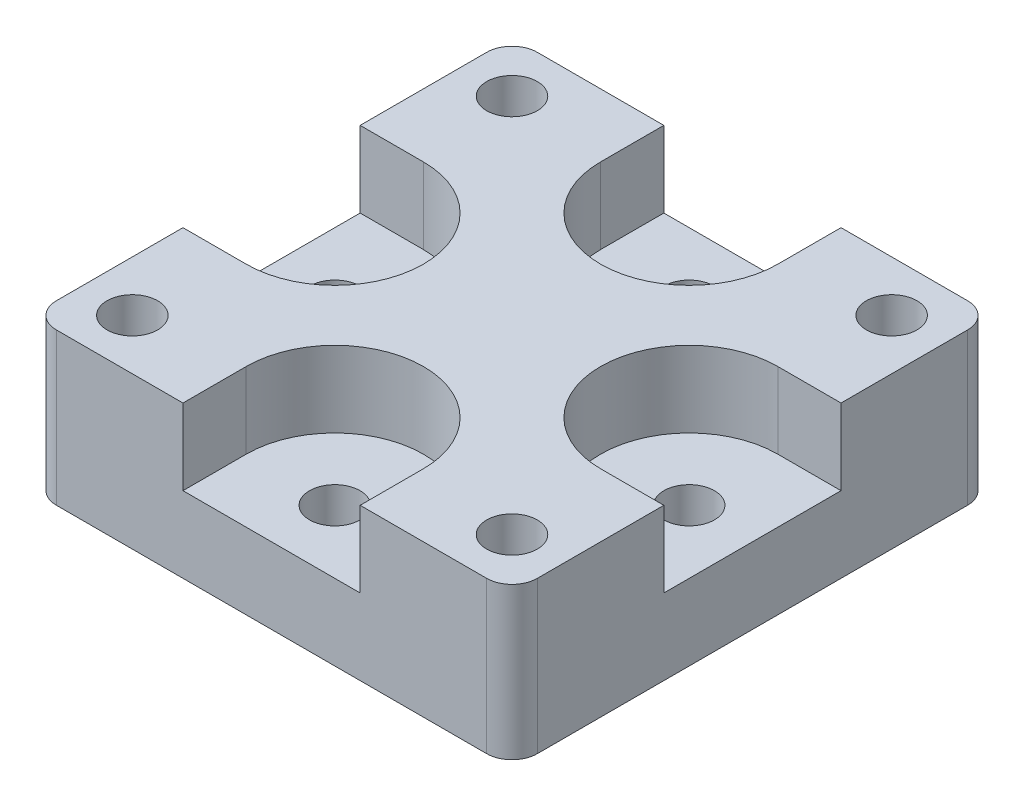
ISO-10303-21;
HEADER;
FILE_DESCRIPTION(('STEP AP214'),'2;1');
FILE_NAME('part.step','',(''),(''),'','','');
FILE_SCHEMA(('AUTOMOTIVE_DESIGN { 1 0 10303 214 1 1 1 1 }'));
ENDSEC;
DATA;
#1=APPLICATION_CONTEXT('core data for automotive mechanical design processes');
#2=APPLICATION_PROTOCOL_DEFINITION('international standard','automotive_design',2000,#1);
#3=PRODUCT_CONTEXT('',#1,'mechanical');
#4=PRODUCT('Part','Part','',(#3));
#5=PRODUCT_RELATED_PRODUCT_CATEGORY('part','',(#4));
#6=PRODUCT_DEFINITION_FORMATION('','',#4);
#7=PRODUCT_DEFINITION_CONTEXT('part definition',#1,'design');
#8=PRODUCT_DEFINITION('design','',#6,#7);
#9=PRODUCT_DEFINITION_SHAPE('','',#8);
#10=(LENGTH_UNIT() NAMED_UNIT(*) SI_UNIT(.MILLI.,.METRE.));
#11=(NAMED_UNIT(*) PLANE_ANGLE_UNIT() SI_UNIT($,.RADIAN.));
#12=(NAMED_UNIT(*) SI_UNIT($,.STERADIAN.) SOLID_ANGLE_UNIT());
#13=UNCERTAINTY_MEASURE_WITH_UNIT(LENGTH_MEASURE(1.E-05),#10,'distance_accuracy_value','');
#14=(GEOMETRIC_REPRESENTATION_CONTEXT(3) GLOBAL_UNCERTAINTY_ASSIGNED_CONTEXT((#13)) GLOBAL_UNIT_ASSIGNED_CONTEXT((#10,
#11,#12)) REPRESENTATION_CONTEXT('',''));
#15=CARTESIAN_POINT('',(0.,0.,0.));
#16=DIRECTION('',(0.,0.,1.));
#17=DIRECTION('',(1.,0.,0.));
#18=AXIS2_PLACEMENT_3D('',#15,#16,#17);
#19=CARTESIAN_POINT('',(2.5,0.,-9.5));
#20=DIRECTION('',(0.,1.,0.));
#21=DIRECTION('',(0.,0.,1.));
#22=AXIS2_PLACEMENT_3D('',#19,#20,#21);
#23=CYLINDRICAL_SURFACE('',#22,1.);
#24=CARTESIAN_POINT('',(2.5,0.,-9.5));
#25=DIRECTION('',(0.,1.,0.));
#26=DIRECTION('',(0.,0.,1.));
#27=AXIS2_PLACEMENT_3D('',#24,#25,#26);
#28=CIRCLE('',#27,1.);
#29=CARTESIAN_POINT('',(2.5,0.,-8.5));
#30=VERTEX_POINT('',#29);
#31=EDGE_CURVE('E292',#30,#30,#28,.T.);
#32=ORIENTED_EDGE('',*,*,#31,.F.);
#33=EDGE_LOOP('',(#32));
#34=FACE_BOUND('',#33,.T.);
#35=CARTESIAN_POINT('',(2.5,3.,-9.5));
#36=DIRECTION('',(0.,1.,0.));
#37=DIRECTION('',(0.,0.,1.));
#38=AXIS2_PLACEMENT_3D('',#35,#36,#37);
#39=CIRCLE('',#38,1.);
#40=CARTESIAN_POINT('',(2.5,3.,-8.5));
#41=VERTEX_POINT('',#40);
#42=EDGE_CURVE('E267',#41,#41,#39,.F.);
#43=ORIENTED_EDGE('',*,*,#42,.F.);
#44=EDGE_LOOP('',(#43));
#45=FACE_BOUND('',#44,.T.);
#46=ADVANCED_FACE('F35',(#34,#45),#23,.F.);
#47=CARTESIAN_POINT('',(9.5,0.,-2.5));
#48=DIRECTION('',(0.,1.,0.));
#49=DIRECTION('',(0.,0.,1.));
#50=AXIS2_PLACEMENT_3D('',#47,#48,#49);
#51=CYLINDRICAL_SURFACE('',#50,1.);
#52=CARTESIAN_POINT('',(9.5,0.,-2.5));
#53=DIRECTION('',(0.,1.,0.));
#54=DIRECTION('',(0.,0.,1.));
#55=AXIS2_PLACEMENT_3D('',#52,#53,#54);
#56=CIRCLE('',#55,1.);
#57=CARTESIAN_POINT('',(9.5,0.,-1.49999999999999));
#58=VERTEX_POINT('',#57);
#59=EDGE_CURVE('E297',#58,#58,#56,.T.);
#60=ORIENTED_EDGE('',*,*,#59,.F.);
#61=EDGE_LOOP('',(#60));
#62=FACE_BOUND('',#61,.T.);
#63=CARTESIAN_POINT('',(9.5,3.,-2.5));
#64=DIRECTION('',(0.,1.,0.));
#65=DIRECTION('',(0.,0.,1.));
#66=AXIS2_PLACEMENT_3D('',#63,#64,#65);
#67=CIRCLE('',#66,1.);
#68=CARTESIAN_POINT('',(9.5,3.,-1.49999999999999));
#69=VERTEX_POINT('',#68);
#70=EDGE_CURVE('E264',#69,#69,#67,.F.);
#71=ORIENTED_EDGE('',*,*,#70,.F.);
#72=EDGE_LOOP('',(#71));
#73=FACE_BOUND('',#72,.T.);
#74=ADVANCED_FACE('F472',(#62,#73),#51,.F.);
#75=CARTESIAN_POINT('',(16.5,0.,-9.5));
#76=DIRECTION('',(0.,1.,0.));
#77=DIRECTION('',(0.,0.,1.));
#78=AXIS2_PLACEMENT_3D('',#75,#76,#77);
#79=CYLINDRICAL_SURFACE('',#78,1.);
#80=CARTESIAN_POINT('',(16.5,0.,-9.5));
#81=DIRECTION('',(0.,1.,0.));
#82=DIRECTION('',(0.,0.,1.));
#83=AXIS2_PLACEMENT_3D('',#80,#81,#82);
#84=CIRCLE('',#83,1.);
#85=CARTESIAN_POINT('',(16.5,0.,-8.5));
#86=VERTEX_POINT('',#85);
#87=EDGE_CURVE('E293',#86,#86,#84,.T.);
#88=ORIENTED_EDGE('',*,*,#87,.F.);
#89=EDGE_LOOP('',(#88));
#90=FACE_BOUND('',#89,.T.);
#91=CARTESIAN_POINT('',(16.5,3.,-9.5));
#92=DIRECTION('',(0.,1.,0.));
#93=DIRECTION('',(0.,0.,1.));
#94=AXIS2_PLACEMENT_3D('',#91,#92,#93);
#95=CIRCLE('',#94,1.);
#96=CARTESIAN_POINT('',(16.5,3.,-8.5));
#97=VERTEX_POINT('',#96);
#98=EDGE_CURVE('E260',#97,#97,#95,.F.);
#99=ORIENTED_EDGE('',*,*,#98,.F.);
#100=EDGE_LOOP('',(#99));
#101=FACE_BOUND('',#100,.T.);
#102=ADVANCED_FACE('F479',(#90,#101),#79,.F.);
#103=CARTESIAN_POINT('',(9.5,0.,-16.5));
#104=DIRECTION('',(0.,1.,0.));
#105=DIRECTION('',(0.,0.,1.));
#106=AXIS2_PLACEMENT_3D('',#103,#104,#105);
#107=CYLINDRICAL_SURFACE('',#106,1.);
#108=CARTESIAN_POINT('',(9.5,0.,-16.5));
#109=DIRECTION('',(0.,1.,0.));
#110=DIRECTION('',(0.,0.,1.));
#111=AXIS2_PLACEMENT_3D('',#108,#109,#110);
#112=CIRCLE('',#111,1.);
#113=CARTESIAN_POINT('',(9.5,0.,-15.5));
#114=VERTEX_POINT('',#113);
#115=EDGE_CURVE('E296',#114,#114,#112,.T.);
#116=ORIENTED_EDGE('',*,*,#115,.F.);
#117=EDGE_LOOP('',(#116));
#118=FACE_BOUND('',#117,.T.);
#119=CARTESIAN_POINT('',(9.5,3.,-16.5));
#120=DIRECTION('',(0.,1.,0.));
#121=DIRECTION('',(0.,0.,1.));
#122=AXIS2_PLACEMENT_3D('',#119,#120,#121);
#123=CIRCLE('',#122,1.);
#124=CARTESIAN_POINT('',(9.5,3.,-15.5));
#125=VERTEX_POINT('',#124);
#126=EDGE_CURVE('E288',#125,#125,#123,.F.);
#127=ORIENTED_EDGE('',*,*,#126,.F.);
#128=EDGE_LOOP('',(#127));
#129=FACE_BOUND('',#128,.T.);
#130=ADVANCED_FACE('F486',(#118,#129),#107,.F.);
#131=CARTESIAN_POINT('',(0.,6.,0.));
#132=DIRECTION('',(0.,-1.,0.));
#133=DIRECTION('',(0.,0.,-1.));
#134=AXIS2_PLACEMENT_3D('',#131,#132,#133);
#135=PLANE('',#134);
#136=CARTESIAN_POINT('',(16.5,6.,-9.5));
#137=DIRECTION('',(0.,1.,0.));
#138=DIRECTION('',(0.,0.,1.));
#139=AXIS2_PLACEMENT_3D('',#136,#137,#138);
#140=CIRCLE('',#139,3.5);
#141=CARTESIAN_POINT('',(16.5,6.,-13.));
#142=VERTEX_POINT('',#141);
#143=CARTESIAN_POINT('',(16.5,6.,-6.));
#144=VERTEX_POINT('',#143);
#145=EDGE_CURVE('E238',#142,#144,#140,.T.);
#146=ORIENTED_EDGE('',*,*,#145,.F.);
#147=DIRECTION('',(-1.,0.,0.));
#148=VECTOR('',#147,1.);
#149=CARTESIAN_POINT('',(16.5,6.,-13.));
#150=LINE('',#149,#148);
#151=CARTESIAN_POINT('',(19.,6.,-13.));
#152=VERTEX_POINT('',#151);
#153=EDGE_CURVE('E236',#152,#142,#150,.T.);
#154=ORIENTED_EDGE('',*,*,#153,.F.);
#155=DIRECTION('',(0.,0.,-1.));
#156=VECTOR('',#155,1.);
#157=CARTESIAN_POINT('',(19.,6.,0.));
#158=LINE('',#157,#156);
#159=CARTESIAN_POINT('',(19.,6.,-18.));
#160=VERTEX_POINT('',#159);
#161=EDGE_CURVE('E337',#152,#160,#158,.T.);
#162=ORIENTED_EDGE('',*,*,#161,.T.);
#163=CARTESIAN_POINT('',(18.,6.,-18.));
#164=DIRECTION('',(0.,-1.,0.));
#165=DIRECTION('',(0.,0.,-1.));
#166=AXIS2_PLACEMENT_3D('',#163,#164,#165);
#167=CIRCLE('',#166,1.);
#168=CARTESIAN_POINT('',(18.,6.,-19.));
#169=VERTEX_POINT('',#168);
#170=EDGE_CURVE('E376',#160,#169,#167,.F.);
#171=ORIENTED_EDGE('',*,*,#170,.T.);
#172=DIRECTION('',(-1.,0.,0.));
#173=VECTOR('',#172,1.);
#174=CARTESIAN_POINT('',(0.,6.,-19.));
#175=LINE('',#174,#173);
#176=CARTESIAN_POINT('',(13.,6.,-19.));
#177=VERTEX_POINT('',#176);
#178=EDGE_CURVE('E342',#169,#177,#175,.T.);
#179=ORIENTED_EDGE('',*,*,#178,.T.);
#180=DIRECTION('',(0.,0.,-1.));
#181=VECTOR('',#180,1.);
#182=CARTESIAN_POINT('',(13.,6.,-21.9359466000526));
#183=LINE('',#182,#181);
#184=CARTESIAN_POINT('',(13.,6.,-16.5));
#185=VERTEX_POINT('',#184);
#186=EDGE_CURVE('E282',#185,#177,#183,.T.);
#187=ORIENTED_EDGE('',*,*,#186,.F.);
#188=CARTESIAN_POINT('',(9.5,6.,-16.5));
#189=DIRECTION('',(0.,1.,0.));
#190=DIRECTION('',(0.,0.,1.));
#191=AXIS2_PLACEMENT_3D('',#188,#189,#190);
#192=CIRCLE('',#191,3.5);
#193=CARTESIAN_POINT('',(6.,6.,-16.5));
#194=VERTEX_POINT('',#193);
#195=EDGE_CURVE('E270',#194,#185,#192,.T.);
#196=ORIENTED_EDGE('',*,*,#195,.F.);
#197=DIRECTION('',(0.,0.,1.));
#198=VECTOR('',#197,1.);
#199=CARTESIAN_POINT('',(6.,6.,-16.5));
#200=LINE('',#199,#198);
#201=CARTESIAN_POINT('',(6.,6.,-19.));
#202=VERTEX_POINT('',#201);
#203=EDGE_CURVE('E275',#202,#194,#200,.T.);
#204=ORIENTED_EDGE('',*,*,#203,.F.);
#205=CARTESIAN_POINT('',(1.,6.,-19.));
#206=VERTEX_POINT('',#205);
#207=EDGE_CURVE('E341',#202,#206,#175,.T.);
#208=ORIENTED_EDGE('',*,*,#207,.T.);
#209=CARTESIAN_POINT('',(1.,6.,-18.));
#210=DIRECTION('',(0.,-1.,0.));
#211=DIRECTION('',(0.,0.,-1.));
#212=AXIS2_PLACEMENT_3D('',#209,#210,#211);
#213=CIRCLE('',#212,1.);
#214=CARTESIAN_POINT('',(0.,6.,-18.));
#215=VERTEX_POINT('',#214);
#216=EDGE_CURVE('E378',#206,#215,#213,.F.);
#217=ORIENTED_EDGE('',*,*,#216,.T.);
#218=DIRECTION('',(0.,0.,1.));
#219=VECTOR('',#218,1.);
#220=CARTESIAN_POINT('',(0.,6.,0.));
#221=LINE('',#220,#219);
#222=CARTESIAN_POINT('',(0.,6.,-13.));
#223=VERTEX_POINT('',#222);
#224=EDGE_CURVE('E329',#215,#223,#221,.T.);
#225=ORIENTED_EDGE('',*,*,#224,.T.);
#226=DIRECTION('',(-1.,0.,0.));
#227=VECTOR('',#226,1.);
#228=CARTESIAN_POINT('',(-3.69893695395263,6.,-13.));
#229=LINE('',#228,#227);
#230=CARTESIAN_POINT('',(2.5,6.,-13.));
#231=VERTEX_POINT('',#230);
#232=EDGE_CURVE('E218',#231,#223,#229,.T.);
#233=ORIENTED_EDGE('',*,*,#232,.F.);
#234=CARTESIAN_POINT('',(2.5,6.,-9.5));
#235=DIRECTION('',(0.,1.,0.));
#236=DIRECTION('',(0.,0.,1.));
#237=AXIS2_PLACEMENT_3D('',#234,#235,#236);
#238=CIRCLE('',#237,3.5);
#239=CARTESIAN_POINT('',(2.5,6.,-6.));
#240=VERTEX_POINT('',#239);
#241=EDGE_CURVE('E203',#240,#231,#238,.T.);
#242=ORIENTED_EDGE('',*,*,#241,.F.);
#243=DIRECTION('',(1.,0.,0.));
#244=VECTOR('',#243,1.);
#245=CARTESIAN_POINT('',(2.5,6.,-6.));
#246=LINE('',#245,#244);
#247=CARTESIAN_POINT('',(0.,6.,-6.));
#248=VERTEX_POINT('',#247);
#249=EDGE_CURVE('E216',#248,#240,#246,.T.);
#250=ORIENTED_EDGE('',*,*,#249,.F.);
#251=CARTESIAN_POINT('',(0.,6.,-1.));
#252=VERTEX_POINT('',#251);
#253=EDGE_CURVE('E333',#248,#252,#221,.T.);
#254=ORIENTED_EDGE('',*,*,#253,.T.);
#255=CARTESIAN_POINT('',(1.,6.,-1.));
#256=DIRECTION('',(0.,-1.,0.));
#257=DIRECTION('',(0.,0.,-1.));
#258=AXIS2_PLACEMENT_3D('',#255,#256,#257);
#259=CIRCLE('',#258,1.);
#260=CARTESIAN_POINT('',(1.,6.,0.));
#261=VERTEX_POINT('',#260);
#262=EDGE_CURVE('E380',#252,#261,#259,.F.);
#263=ORIENTED_EDGE('',*,*,#262,.T.);
#264=DIRECTION('',(1.,0.,0.));
#265=VECTOR('',#264,1.);
#266=CARTESIAN_POINT('',(0.,6.,0.));
#267=LINE('',#266,#265);
#268=CARTESIAN_POINT('',(6.,6.,0.));
#269=VERTEX_POINT('',#268);
#270=EDGE_CURVE('E334',#261,#269,#267,.T.);
#271=ORIENTED_EDGE('',*,*,#270,.T.);
#272=DIRECTION('',(0.,0.,1.));
#273=VECTOR('',#272,1.);
#274=CARTESIAN_POINT('',(6.,6.,4.79915929698294));
#275=LINE('',#274,#273);
#276=CARTESIAN_POINT('',(6.,6.,-2.5));
#277=VERTEX_POINT('',#276);
#278=EDGE_CURVE('E254',#277,#269,#275,.T.);
#279=ORIENTED_EDGE('',*,*,#278,.F.);
#280=CARTESIAN_POINT('',(9.5,6.,-2.5));
#281=DIRECTION('',(0.,1.,0.));
#282=DIRECTION('',(0.,0.,1.));
#283=AXIS2_PLACEMENT_3D('',#280,#281,#282);
#284=CIRCLE('',#283,3.5);
#285=CARTESIAN_POINT('',(13.,6.,-2.5));
#286=VERTEX_POINT('',#285);
#287=EDGE_CURVE('E225',#286,#277,#284,.T.);
#288=ORIENTED_EDGE('',*,*,#287,.F.);
#289=DIRECTION('',(0.,0.,-1.));
#290=VECTOR('',#289,1.);
#291=CARTESIAN_POINT('',(13.,6.,-2.5));
#292=LINE('',#291,#290);
#293=CARTESIAN_POINT('',(13.,6.,0.));
#294=VERTEX_POINT('',#293);
#295=EDGE_CURVE('E247',#294,#286,#292,.T.);
#296=ORIENTED_EDGE('',*,*,#295,.F.);
#297=CARTESIAN_POINT('',(18.,6.,0.));
#298=VERTEX_POINT('',#297);
#299=EDGE_CURVE('E332',#294,#298,#267,.T.);
#300=ORIENTED_EDGE('',*,*,#299,.T.);
#301=CARTESIAN_POINT('',(18.,6.,-1.));
#302=DIRECTION('',(0.,-1.,0.));
#303=DIRECTION('',(0.,0.,-1.));
#304=AXIS2_PLACEMENT_3D('',#301,#302,#303);
#305=CIRCLE('',#304,1.);
#306=CARTESIAN_POINT('',(19.,6.,-1.));
#307=VERTEX_POINT('',#306);
#308=EDGE_CURVE('E382',#298,#307,#305,.F.);
#309=ORIENTED_EDGE('',*,*,#308,.T.);
#310=CARTESIAN_POINT('',(19.,6.,-6.));
#311=VERTEX_POINT('',#310);
#312=EDGE_CURVE('E338',#307,#311,#158,.T.);
#313=ORIENTED_EDGE('',*,*,#312,.T.);
#314=DIRECTION('',(1.,0.,0.));
#315=VECTOR('',#314,1.);
#316=CARTESIAN_POINT('',(22.836899795351,6.,-6.));
#317=LINE('',#316,#315);
#318=EDGE_CURVE('E230',#144,#311,#317,.T.);
#319=ORIENTED_EDGE('',*,*,#318,.F.);
#320=EDGE_LOOP('',(#146,#154,#162,#171,#179,#187,#196,#204,#208,#217,#225,#233,#242,#250,#254,
#263,#271,#279,#288,#296,#300,#309,#313,#319));
#321=FACE_BOUND('',#320,.T.);
#322=CARTESIAN_POINT('',(2.,6.,-17.));
#323=DIRECTION('',(0.,1.,0.));
#324=DIRECTION('',(0.,0.,1.));
#325=AXIS2_PLACEMENT_3D('',#322,#323,#324);
#326=CIRCLE('',#325,1.);
#327=CARTESIAN_POINT('',(2.,6.,-16.));
#328=VERTEX_POINT('',#327);
#329=EDGE_CURVE('E323',#328,#328,#326,.T.);
#330=ORIENTED_EDGE('',*,*,#329,.F.);
#331=EDGE_LOOP('',(#330));
#332=FACE_BOUND('',#331,.T.);
#333=CARTESIAN_POINT('',(17.,6.,-17.));
#334=DIRECTION('',(0.,1.,0.));
#335=DIRECTION('',(0.,0.,1.));
#336=AXIS2_PLACEMENT_3D('',#333,#334,#335);
#337=CIRCLE('',#336,0.999999999999998);
#338=CARTESIAN_POINT('',(17.,6.,-16.));
#339=VERTEX_POINT('',#338);
#340=EDGE_CURVE('E317',#339,#339,#337,.T.);
#341=ORIENTED_EDGE('',*,*,#340,.F.);
#342=EDGE_LOOP('',(#341));
#343=FACE_BOUND('',#342,.T.);
#344=CARTESIAN_POINT('',(17.,6.,-2.));
#345=DIRECTION('',(0.,1.,0.));
#346=DIRECTION('',(0.,0.,1.));
#347=AXIS2_PLACEMENT_3D('',#344,#345,#346);
#348=CIRCLE('',#347,0.999999999999998);
#349=CARTESIAN_POINT('',(17.,6.,-1.));
#350=VERTEX_POINT('',#349);
#351=EDGE_CURVE('E311',#350,#350,#348,.T.);
#352=ORIENTED_EDGE('',*,*,#351,.F.);
#353=EDGE_LOOP('',(#352));
#354=FACE_BOUND('',#353,.T.);
#355=CARTESIAN_POINT('',(2.,6.,-2.));
#356=DIRECTION('',(0.,1.,0.));
#357=DIRECTION('',(0.,0.,1.));
#358=AXIS2_PLACEMENT_3D('',#355,#356,#357);
#359=CIRCLE('',#358,1.);
#360=CARTESIAN_POINT('',(2.,6.,-1.));
#361=VERTEX_POINT('',#360);
#362=EDGE_CURVE('E305',#361,#361,#359,.T.);
#363=ORIENTED_EDGE('',*,*,#362,.F.);
#364=EDGE_LOOP('',(#363));
#365=FACE_BOUND('',#364,.T.);
#366=ADVANCED_FACE('F428',(#321,#332,#343,#354,#365),#135,.F.);
#367=CARTESIAN_POINT('',(0.,0.,0.));
#368=DIRECTION('',(0.,-1.,0.));
#369=DIRECTION('',(0.,0.,-1.));
#370=AXIS2_PLACEMENT_3D('',#367,#368,#369);
#371=PLANE('',#370);
#372=ORIENTED_EDGE('',*,*,#87,.T.);
#373=EDGE_LOOP('',(#372));
#374=FACE_BOUND('',#373,.T.);
#375=ORIENTED_EDGE('',*,*,#59,.T.);
#376=EDGE_LOOP('',(#375));
#377=FACE_BOUND('',#376,.T.);
#378=ORIENTED_EDGE('',*,*,#31,.T.);
#379=EDGE_LOOP('',(#378));
#380=FACE_BOUND('',#379,.T.);
#381=ORIENTED_EDGE('',*,*,#115,.T.);
#382=EDGE_LOOP('',(#381));
#383=FACE_BOUND('',#382,.T.);
#384=CARTESIAN_POINT('',(17.,0.,-2.));
#385=DIRECTION('',(0.,1.,0.));
#386=DIRECTION('',(0.,0.,1.));
#387=AXIS2_PLACEMENT_3D('',#384,#385,#386);
#388=CIRCLE('',#387,0.999999999999998);
#389=CARTESIAN_POINT('',(17.,0.,-1.));
#390=VERTEX_POINT('',#389);
#391=EDGE_CURVE('E308',#390,#390,#388,.T.);
#392=ORIENTED_EDGE('',*,*,#391,.T.);
#393=EDGE_LOOP('',(#392));
#394=FACE_BOUND('',#393,.T.);
#395=CARTESIAN_POINT('',(2.,0.,-17.));
#396=DIRECTION('',(0.,1.,0.));
#397=DIRECTION('',(0.,0.,1.));
#398=AXIS2_PLACEMENT_3D('',#395,#396,#397);
#399=CIRCLE('',#398,1.);
#400=CARTESIAN_POINT('',(2.,0.,-16.));
#401=VERTEX_POINT('',#400);
#402=EDGE_CURVE('E320',#401,#401,#399,.T.);
#403=ORIENTED_EDGE('',*,*,#402,.T.);
#404=EDGE_LOOP('',(#403));
#405=FACE_BOUND('',#404,.T.);
#406=DIRECTION('',(0.,0.,-1.));
#407=VECTOR('',#406,1.);
#408=CARTESIAN_POINT('',(19.,0.,0.));
#409=LINE('',#408,#407);
#410=CARTESIAN_POINT('',(19.,0.,-1.));
#411=VERTEX_POINT('',#410);
#412=CARTESIAN_POINT('',(19.,0.,-18.));
#413=VERTEX_POINT('',#412);
#414=EDGE_CURVE('E351',#411,#413,#409,.T.);
#415=ORIENTED_EDGE('',*,*,#414,.F.);
#416=CARTESIAN_POINT('',(18.,0.,-1.));
#417=DIRECTION('',(0.,-1.,0.));
#418=DIRECTION('',(0.,0.,-1.));
#419=AXIS2_PLACEMENT_3D('',#416,#417,#418);
#420=CIRCLE('',#419,1.);
#421=CARTESIAN_POINT('',(18.,0.,0.));
#422=VERTEX_POINT('',#421);
#423=EDGE_CURVE('E368',#411,#422,#420,.T.);
#424=ORIENTED_EDGE('',*,*,#423,.T.);
#425=DIRECTION('',(1.,0.,0.));
#426=VECTOR('',#425,1.);
#427=CARTESIAN_POINT('',(0.,0.,0.));
#428=LINE('',#427,#426);
#429=CARTESIAN_POINT('',(1.,0.,0.));
#430=VERTEX_POINT('',#429);
#431=EDGE_CURVE('E348',#430,#422,#428,.T.);
#432=ORIENTED_EDGE('',*,*,#431,.F.);
#433=CARTESIAN_POINT('',(1.,0.,-1.));
#434=DIRECTION('',(0.,-1.,0.));
#435=DIRECTION('',(0.,0.,-1.));
#436=AXIS2_PLACEMENT_3D('',#433,#434,#435);
#437=CIRCLE('',#436,1.);
#438=CARTESIAN_POINT('',(0.,0.,-1.));
#439=VERTEX_POINT('',#438);
#440=EDGE_CURVE('E366',#430,#439,#437,.T.);
#441=ORIENTED_EDGE('',*,*,#440,.T.);
#442=DIRECTION('',(0.,0.,1.));
#443=VECTOR('',#442,1.);
#444=CARTESIAN_POINT('',(0.,0.,0.));
#445=LINE('',#444,#443);
#446=CARTESIAN_POINT('',(0.,0.,-18.));
#447=VERTEX_POINT('',#446);
#448=EDGE_CURVE('E326',#447,#439,#445,.T.);
#449=ORIENTED_EDGE('',*,*,#448,.F.);
#450=CARTESIAN_POINT('',(1.,0.,-18.));
#451=DIRECTION('',(0.,-1.,0.));
#452=DIRECTION('',(0.,0.,-1.));
#453=AXIS2_PLACEMENT_3D('',#450,#451,#452);
#454=CIRCLE('',#453,1.);
#455=CARTESIAN_POINT('',(1.,0.,-19.));
#456=VERTEX_POINT('',#455);
#457=EDGE_CURVE('E364',#447,#456,#454,.T.);
#458=ORIENTED_EDGE('',*,*,#457,.T.);
#459=DIRECTION('',(-1.,0.,0.));
#460=VECTOR('',#459,1.);
#461=CARTESIAN_POINT('',(0.,0.,-19.));
#462=LINE('',#461,#460);
#463=CARTESIAN_POINT('',(18.,0.,-19.));
#464=VERTEX_POINT('',#463);
#465=EDGE_CURVE('E354',#464,#456,#462,.T.);
#466=ORIENTED_EDGE('',*,*,#465,.F.);
#467=CARTESIAN_POINT('',(18.,0.,-18.));
#468=DIRECTION('',(0.,-1.,0.));
#469=DIRECTION('',(0.,0.,-1.));
#470=AXIS2_PLACEMENT_3D('',#467,#468,#469);
#471=CIRCLE('',#470,1.);
#472=EDGE_CURVE('E362',#464,#413,#471,.T.);
#473=ORIENTED_EDGE('',*,*,#472,.T.);
#474=EDGE_LOOP('',(#415,#424,#432,#441,#449,#458,#466,#473));
#475=FACE_BOUND('',#474,.T.);
#476=CARTESIAN_POINT('',(17.,0.,-17.));
#477=DIRECTION('',(0.,1.,0.));
#478=DIRECTION('',(0.,0.,1.));
#479=AXIS2_PLACEMENT_3D('',#476,#477,#478);
#480=CIRCLE('',#479,0.999999999999998);
#481=CARTESIAN_POINT('',(17.,0.,-16.));
#482=VERTEX_POINT('',#481);
#483=EDGE_CURVE('E314',#482,#482,#480,.T.);
#484=ORIENTED_EDGE('',*,*,#483,.T.);
#485=EDGE_LOOP('',(#484));
#486=FACE_BOUND('',#485,.T.);
#487=CARTESIAN_POINT('',(2.,0.,-2.));
#488=DIRECTION('',(0.,1.,0.));
#489=DIRECTION('',(0.,0.,1.));
#490=AXIS2_PLACEMENT_3D('',#487,#488,#489);
#491=CIRCLE('',#490,1.);
#492=CARTESIAN_POINT('',(2.,0.,-1.));
#493=VERTEX_POINT('',#492);
#494=EDGE_CURVE('E304',#493,#493,#491,.T.);
#495=ORIENTED_EDGE('',*,*,#494,.T.);
#496=EDGE_LOOP('',(#495));
#497=FACE_BOUND('',#496,.T.);
#498=ADVANCED_FACE('F440',(#374,#377,#380,#383,#394,#405,#475,#486,#497),#371,.T.);
#499=CARTESIAN_POINT('',(0.,6.,0.));
#500=DIRECTION('',(1.,0.,0.));
#501=DIRECTION('',(0.,0.,-1.));
#502=AXIS2_PLACEMENT_3D('',#499,#500,#501);
#503=PLANE('',#502);
#504=ORIENTED_EDGE('',*,*,#253,.F.);
#505=DIRECTION('',(0.,-1.,0.));
#506=VECTOR('',#505,1.);
#507=CARTESIAN_POINT('',(0.,6.,-6.));
#508=LINE('',#507,#506);
#509=CARTESIAN_POINT('',(0.,3.,-6.));
#510=VERTEX_POINT('',#509);
#511=EDGE_CURVE('E11',#248,#510,#508,.T.);
#512=ORIENTED_EDGE('',*,*,#511,.T.);
#513=DIRECTION('',(0.,0.,1.));
#514=VECTOR('',#513,1.);
#515=CARTESIAN_POINT('',(0.,3.,0.));
#516=LINE('',#515,#514);
#517=CARTESIAN_POINT('',(0.,3.,-13.));
#518=VERTEX_POINT('',#517);
#519=EDGE_CURVE('E268',#518,#510,#516,.T.);
#520=ORIENTED_EDGE('',*,*,#519,.F.);
#521=DIRECTION('',(0.,1.,0.));
#522=VECTOR('',#521,1.);
#523=CARTESIAN_POINT('',(0.,6.,-13.));
#524=LINE('',#523,#522);
#525=EDGE_CURVE('E43',#518,#223,#524,.T.);
#526=ORIENTED_EDGE('',*,*,#525,.T.);
#527=ORIENTED_EDGE('',*,*,#224,.F.);
#528=DIRECTION('',(0.,-1.,0.));
#529=VECTOR('',#528,1.);
#530=CARTESIAN_POINT('',(0.,6.,-18.));
#531=LINE('',#530,#529);
#532=EDGE_CURVE('E384',#215,#447,#531,.T.);
#533=ORIENTED_EDGE('',*,*,#532,.T.);
#534=ORIENTED_EDGE('',*,*,#448,.T.);
#535=DIRECTION('',(0.,-1.,0.));
#536=VECTOR('',#535,1.);
#537=CARTESIAN_POINT('',(0.,6.,-1.));
#538=LINE('',#537,#536);
#539=EDGE_CURVE('E387',#439,#252,#538,.F.);
#540=ORIENTED_EDGE('',*,*,#539,.T.);
#541=EDGE_LOOP('',(#504,#512,#520,#526,#527,#533,#534,#540));
#542=FACE_BOUND('',#541,.T.);
#543=ADVANCED_FACE('F424',(#542),#503,.F.);
#544=CARTESIAN_POINT('',(0.,6.,0.));
#545=DIRECTION('',(0.,0.,-1.));
#546=DIRECTION('',(-1.,0.,0.));
#547=AXIS2_PLACEMENT_3D('',#544,#545,#546);
#548=PLANE('',#547);
#549=ORIENTED_EDGE('',*,*,#299,.F.);
#550=DIRECTION('',(0.,-1.,0.));
#551=VECTOR('',#550,1.);
#552=CARTESIAN_POINT('',(13.,6.,0.));
#553=LINE('',#552,#551);
#554=CARTESIAN_POINT('',(13.,3.,0.));
#555=VERTEX_POINT('',#554);
#556=EDGE_CURVE('E419',#294,#555,#553,.T.);
#557=ORIENTED_EDGE('',*,*,#556,.T.);
#558=DIRECTION('',(1.,0.,0.));
#559=VECTOR('',#558,1.);
#560=CARTESIAN_POINT('',(0.,3.,0.));
#561=LINE('',#560,#559);
#562=CARTESIAN_POINT('',(6.,3.,0.));
#563=VERTEX_POINT('',#562);
#564=EDGE_CURVE('E265',#563,#555,#561,.T.);
#565=ORIENTED_EDGE('',*,*,#564,.F.);
#566=DIRECTION('',(0.,1.,0.));
#567=VECTOR('',#566,1.);
#568=CARTESIAN_POINT('',(6.,6.,0.));
#569=LINE('',#568,#567);
#570=EDGE_CURVE('E416',#563,#269,#569,.T.);
#571=ORIENTED_EDGE('',*,*,#570,.T.);
#572=ORIENTED_EDGE('',*,*,#270,.F.);
#573=DIRECTION('',(0.,-1.,0.));
#574=VECTOR('',#573,1.);
#575=CARTESIAN_POINT('',(1.,6.,0.));
#576=LINE('',#575,#574);
#577=EDGE_CURVE('E370',#261,#430,#576,.T.);
#578=ORIENTED_EDGE('',*,*,#577,.T.);
#579=ORIENTED_EDGE('',*,*,#431,.T.);
#580=DIRECTION('',(0.,-1.,0.));
#581=VECTOR('',#580,1.);
#582=CARTESIAN_POINT('',(18.,6.,0.));
#583=LINE('',#582,#581);
#584=EDGE_CURVE('E373',#422,#298,#583,.F.);
#585=ORIENTED_EDGE('',*,*,#584,.T.);
#586=EDGE_LOOP('',(#549,#557,#565,#571,#572,#578,#579,#585));
#587=FACE_BOUND('',#586,.T.);
#588=ADVANCED_FACE('F451',(#587),#548,.F.);
#589=CARTESIAN_POINT('',(19.,6.,0.));
#590=DIRECTION('',(-1.,0.,0.));
#591=DIRECTION('',(0.,0.,1.));
#592=AXIS2_PLACEMENT_3D('',#589,#590,#591);
#593=PLANE('',#592);
#594=ORIENTED_EDGE('',*,*,#161,.F.);
#595=DIRECTION('',(0.,-1.,0.));
#596=VECTOR('',#595,1.);
#597=CARTESIAN_POINT('',(19.,6.,-13.));
#598=LINE('',#597,#596);
#599=CARTESIAN_POINT('',(19.,3.,-13.));
#600=VERTEX_POINT('',#599);
#601=EDGE_CURVE('E413',#152,#600,#598,.T.);
#602=ORIENTED_EDGE('',*,*,#601,.T.);
#603=DIRECTION('',(0.,0.,-1.));
#604=VECTOR('',#603,1.);
#605=CARTESIAN_POINT('',(19.,3.,0.));
#606=LINE('',#605,#604);
#607=CARTESIAN_POINT('',(19.,3.,-6.));
#608=VERTEX_POINT('',#607);
#609=EDGE_CURVE('E262',#608,#600,#606,.T.);
#610=ORIENTED_EDGE('',*,*,#609,.F.);
#611=DIRECTION('',(0.,1.,0.));
#612=VECTOR('',#611,1.);
#613=CARTESIAN_POINT('',(19.,6.,-6.));
#614=LINE('',#613,#612);
#615=EDGE_CURVE('E404',#608,#311,#614,.T.);
#616=ORIENTED_EDGE('',*,*,#615,.T.);
#617=ORIENTED_EDGE('',*,*,#312,.F.);
#618=DIRECTION('',(0.,-1.,0.));
#619=VECTOR('',#618,1.);
#620=CARTESIAN_POINT('',(19.,6.,-1.));
#621=LINE('',#620,#619);
#622=EDGE_CURVE('E359',#307,#411,#621,.T.);
#623=ORIENTED_EDGE('',*,*,#622,.T.);
#624=ORIENTED_EDGE('',*,*,#414,.T.);
#625=DIRECTION('',(0.,-1.,0.));
#626=VECTOR('',#625,1.);
#627=CARTESIAN_POINT('',(19.,6.,-18.));
#628=LINE('',#627,#626);
#629=EDGE_CURVE('E345',#413,#160,#628,.F.);
#630=ORIENTED_EDGE('',*,*,#629,.T.);
#631=EDGE_LOOP('',(#594,#602,#610,#616,#617,#623,#624,#630));
#632=FACE_BOUND('',#631,.T.);
#633=ADVANCED_FACE('F515',(#632),#593,.F.);
#634=CARTESIAN_POINT('',(0.,6.,-19.));
#635=DIRECTION('',(0.,0.,1.));
#636=DIRECTION('',(1.,0.,0.));
#637=AXIS2_PLACEMENT_3D('',#634,#635,#636);
#638=PLANE('',#637);
#639=ORIENTED_EDGE('',*,*,#207,.F.);
#640=DIRECTION('',(0.,-1.,0.));
#641=VECTOR('',#640,1.);
#642=CARTESIAN_POINT('',(6.,6.,-19.));
#643=LINE('',#642,#641);
#644=CARTESIAN_POINT('',(6.,3.,-19.));
#645=VERTEX_POINT('',#644);
#646=EDGE_CURVE('E401',#202,#645,#643,.T.);
#647=ORIENTED_EDGE('',*,*,#646,.T.);
#648=DIRECTION('',(-1.,0.,0.));
#649=VECTOR('',#648,1.);
#650=CARTESIAN_POINT('',(0.,3.,-19.));
#651=LINE('',#650,#649);
#652=CARTESIAN_POINT('',(13.,3.,-19.));
#653=VERTEX_POINT('',#652);
#654=EDGE_CURVE('E290',#653,#645,#651,.T.);
#655=ORIENTED_EDGE('',*,*,#654,.F.);
#656=DIRECTION('',(0.,1.,0.));
#657=VECTOR('',#656,1.);
#658=CARTESIAN_POINT('',(13.,6.,-19.));
#659=LINE('',#658,#657);
#660=EDGE_CURVE('E396',#653,#177,#659,.T.);
#661=ORIENTED_EDGE('',*,*,#660,.T.);
#662=ORIENTED_EDGE('',*,*,#178,.F.);
#663=DIRECTION('',(0.,-1.,0.));
#664=VECTOR('',#663,1.);
#665=CARTESIAN_POINT('',(18.,6.,-19.));
#666=LINE('',#665,#664);
#667=EDGE_CURVE('E390',#169,#464,#666,.T.);
#668=ORIENTED_EDGE('',*,*,#667,.T.);
#669=ORIENTED_EDGE('',*,*,#465,.T.);
#670=DIRECTION('',(0.,-1.,0.));
#671=VECTOR('',#670,1.);
#672=CARTESIAN_POINT('',(1.,6.,-19.));
#673=LINE('',#672,#671);
#674=EDGE_CURVE('E393',#456,#206,#673,.F.);
#675=ORIENTED_EDGE('',*,*,#674,.T.);
#676=EDGE_LOOP('',(#639,#647,#655,#661,#662,#668,#669,#675));
#677=FACE_BOUND('',#676,.T.);
#678=ADVANCED_FACE('F506',(#677),#638,.F.);
#679=CARTESIAN_POINT('',(2.,6.,-17.));
#680=DIRECTION('',(0.,-1.,0.));
#681=DIRECTION('',(0.,0.,-1.));
#682=AXIS2_PLACEMENT_3D('',#679,#680,#681);
#683=CYLINDRICAL_SURFACE('',#682,1.);
#684=ORIENTED_EDGE('',*,*,#329,.T.);
#685=EDGE_LOOP('',(#684));
#686=FACE_BOUND('',#685,.T.);
#687=ORIENTED_EDGE('',*,*,#402,.F.);
#688=EDGE_LOOP('',(#687));
#689=FACE_BOUND('',#688,.T.);
#690=ADVANCED_FACE('F502',(#686,#689),#683,.F.);
#691=CARTESIAN_POINT('',(17.,6.,-17.));
#692=DIRECTION('',(0.,-1.,0.));
#693=DIRECTION('',(0.,0.,-1.));
#694=AXIS2_PLACEMENT_3D('',#691,#692,#693);
#695=CYLINDRICAL_SURFACE('',#694,0.999999999999998);
#696=ORIENTED_EDGE('',*,*,#340,.T.);
#697=EDGE_LOOP('',(#696));
#698=FACE_BOUND('',#697,.T.);
#699=ORIENTED_EDGE('',*,*,#483,.F.);
#700=EDGE_LOOP('',(#699));
#701=FACE_BOUND('',#700,.T.);
#702=ADVANCED_FACE('F498',(#698,#701),#695,.F.);
#703=CARTESIAN_POINT('',(17.,6.,-2.));
#704=DIRECTION('',(0.,-1.,0.));
#705=DIRECTION('',(0.,0.,-1.));
#706=AXIS2_PLACEMENT_3D('',#703,#704,#705);
#707=CYLINDRICAL_SURFACE('',#706,0.999999999999998);
#708=ORIENTED_EDGE('',*,*,#351,.T.);
#709=EDGE_LOOP('',(#708));
#710=FACE_BOUND('',#709,.T.);
#711=ORIENTED_EDGE('',*,*,#391,.F.);
#712=EDGE_LOOP('',(#711));
#713=FACE_BOUND('',#712,.T.);
#714=ADVANCED_FACE('F494',(#710,#713),#707,.F.);
#715=CARTESIAN_POINT('',(2.,6.,-2.));
#716=DIRECTION('',(0.,-1.,0.));
#717=DIRECTION('',(0.,0.,-1.));
#718=AXIS2_PLACEMENT_3D('',#715,#716,#717);
#719=CYLINDRICAL_SURFACE('',#718,1.);
#720=ORIENTED_EDGE('',*,*,#362,.T.);
#721=EDGE_LOOP('',(#720));
#722=FACE_BOUND('',#721,.T.);
#723=ORIENTED_EDGE('',*,*,#494,.F.);
#724=EDGE_LOOP('',(#723));
#725=FACE_BOUND('',#724,.T.);
#726=ADVANCED_FACE('F490',(#722,#725),#719,.F.);
#727=CARTESIAN_POINT('',(18.,6.,-1.));
#728=DIRECTION('',(0.,-1.,0.));
#729=DIRECTION('',(0.,0.,-1.));
#730=AXIS2_PLACEMENT_3D('',#727,#728,#729);
#731=CYLINDRICAL_SURFACE('',#730,1.);
#732=ORIENTED_EDGE('',*,*,#308,.F.);
#733=ORIENTED_EDGE('',*,*,#584,.F.);
#734=ORIENTED_EDGE('',*,*,#423,.F.);
#735=ORIENTED_EDGE('',*,*,#622,.F.);
#736=EDGE_LOOP('',(#732,#733,#734,#735));
#737=FACE_BOUND('',#736,.T.);
#738=ADVANCED_FACE('F493',(#737),#731,.T.);
#739=CARTESIAN_POINT('',(1.,6.,-1.));
#740=DIRECTION('',(0.,-1.,0.));
#741=DIRECTION('',(0.,0.,-1.));
#742=AXIS2_PLACEMENT_3D('',#739,#740,#741);
#743=CYLINDRICAL_SURFACE('',#742,1.);
#744=ORIENTED_EDGE('',*,*,#262,.F.);
#745=ORIENTED_EDGE('',*,*,#539,.F.);
#746=ORIENTED_EDGE('',*,*,#440,.F.);
#747=ORIENTED_EDGE('',*,*,#577,.F.);
#748=EDGE_LOOP('',(#744,#745,#746,#747));
#749=FACE_BOUND('',#748,.T.);
#750=ADVANCED_FACE('F447',(#749),#743,.T.);
#751=CARTESIAN_POINT('',(1.,6.,-18.));
#752=DIRECTION('',(0.,-1.,0.));
#753=DIRECTION('',(0.,0.,-1.));
#754=AXIS2_PLACEMENT_3D('',#751,#752,#753);
#755=CYLINDRICAL_SURFACE('',#754,1.);
#756=ORIENTED_EDGE('',*,*,#216,.F.);
#757=ORIENTED_EDGE('',*,*,#674,.F.);
#758=ORIENTED_EDGE('',*,*,#457,.F.);
#759=ORIENTED_EDGE('',*,*,#532,.F.);
#760=EDGE_LOOP('',(#756,#757,#758,#759));
#761=FACE_BOUND('',#760,.T.);
#762=ADVANCED_FACE('F435',(#761),#755,.T.);
#763=CARTESIAN_POINT('',(18.,6.,-18.));
#764=DIRECTION('',(0.,-1.,0.));
#765=DIRECTION('',(0.,0.,-1.));
#766=AXIS2_PLACEMENT_3D('',#763,#764,#765);
#767=CYLINDRICAL_SURFACE('',#766,1.);
#768=ORIENTED_EDGE('',*,*,#170,.F.);
#769=ORIENTED_EDGE('',*,*,#629,.F.);
#770=ORIENTED_EDGE('',*,*,#472,.F.);
#771=ORIENTED_EDGE('',*,*,#667,.F.);
#772=EDGE_LOOP('',(#768,#769,#770,#771));
#773=FACE_BOUND('',#772,.T.);
#774=ADVANCED_FACE('F37',(#773),#767,.T.);
#775=CARTESIAN_POINT('',(6.,3.,-16.5));
#776=DIRECTION('',(-1.,0.,0.));
#777=DIRECTION('',(0.,0.,1.));
#778=AXIS2_PLACEMENT_3D('',#775,#776,#777);
#779=PLANE('',#778);
#780=ORIENTED_EDGE('',*,*,#203,.T.);
#781=DIRECTION('',(0.,1.,0.));
#782=VECTOR('',#781,1.);
#783=CARTESIAN_POINT('',(6.,3.,-16.5));
#784=LINE('',#783,#782);
#785=CARTESIAN_POINT('',(6.,3.,-16.5));
#786=VERTEX_POINT('',#785);
#787=EDGE_CURVE('E285',#786,#194,#784,.T.);
#788=ORIENTED_EDGE('',*,*,#787,.F.);
#789=DIRECTION('',(0.,0.,1.));
#790=VECTOR('',#789,1.);
#791=CARTESIAN_POINT('',(6.,3.,-16.5));
#792=LINE('',#791,#790);
#793=EDGE_CURVE('E277',#645,#786,#792,.T.);
#794=ORIENTED_EDGE('',*,*,#793,.F.);
#795=ORIENTED_EDGE('',*,*,#646,.F.);
#796=EDGE_LOOP('',(#780,#788,#794,#795));
#797=FACE_BOUND('',#796,.T.);
#798=ADVANCED_FACE('F531',(#797),#779,.F.);
#799=CARTESIAN_POINT('',(13.,3.,-21.9359466000526));
#800=DIRECTION('',(1.,0.,0.));
#801=DIRECTION('',(0.,0.,-1.));
#802=AXIS2_PLACEMENT_3D('',#799,#800,#801);
#803=PLANE('',#802);
#804=DIRECTION('',(0.,0.,-1.));
#805=VECTOR('',#804,1.);
#806=CARTESIAN_POINT('',(13.,3.,-21.9359466000526));
#807=LINE('',#806,#805);
#808=CARTESIAN_POINT('',(13.,3.,-16.5));
#809=VERTEX_POINT('',#808);
#810=EDGE_CURVE('E274',#809,#653,#807,.T.);
#811=ORIENTED_EDGE('',*,*,#810,.F.);
#812=DIRECTION('',(0.,1.,0.));
#813=VECTOR('',#812,1.);
#814=CARTESIAN_POINT('',(13.,3.,-16.5));
#815=LINE('',#814,#813);
#816=EDGE_CURVE('E279',#809,#185,#815,.T.);
#817=ORIENTED_EDGE('',*,*,#816,.T.);
#818=ORIENTED_EDGE('',*,*,#186,.T.);
#819=ORIENTED_EDGE('',*,*,#660,.F.);
#820=EDGE_LOOP('',(#811,#817,#818,#819));
#821=FACE_BOUND('',#820,.T.);
#822=ADVANCED_FACE('F536',(#821),#803,.F.);
#823=CARTESIAN_POINT('',(9.5,3.,-16.5));
#824=DIRECTION('',(0.,1.,0.));
#825=DIRECTION('',(0.,0.,1.));
#826=AXIS2_PLACEMENT_3D('',#823,#824,#825);
#827=PLANE('',#826);
#828=ORIENTED_EDGE('',*,*,#126,.T.);
#829=EDGE_LOOP('',(#828));
#830=FACE_BOUND('',#829,.T.);
#831=ORIENTED_EDGE('',*,*,#654,.T.);
#832=ORIENTED_EDGE('',*,*,#793,.T.);
#833=CARTESIAN_POINT('',(9.5,3.,-16.5));
#834=DIRECTION('',(0.,1.,0.));
#835=DIRECTION('',(0.,0.,1.));
#836=AXIS2_PLACEMENT_3D('',#833,#834,#835);
#837=CIRCLE('',#836,3.5);
#838=EDGE_CURVE('E271',#786,#809,#837,.T.);
#839=ORIENTED_EDGE('',*,*,#838,.T.);
#840=ORIENTED_EDGE('',*,*,#810,.T.);
#841=EDGE_LOOP('',(#831,#832,#839,#840));
#842=FACE_BOUND('',#841,.T.);
#843=ADVANCED_FACE('F581',(#830,#842),#827,.T.);
#844=CARTESIAN_POINT('',(9.5,3.,-16.5));
#845=DIRECTION('',(0.,1.,0.));
#846=DIRECTION('',(0.,0.,1.));
#847=AXIS2_PLACEMENT_3D('',#844,#845,#846);
#848=CYLINDRICAL_SURFACE('',#847,3.5);
#849=ORIENTED_EDGE('',*,*,#195,.T.);
#850=ORIENTED_EDGE('',*,*,#816,.F.);
#851=ORIENTED_EDGE('',*,*,#838,.F.);
#852=ORIENTED_EDGE('',*,*,#787,.T.);
#853=EDGE_LOOP('',(#849,#850,#851,#852));
#854=FACE_BOUND('',#853,.T.);
#855=ADVANCED_FACE('F552',(#854),#848,.F.);
#856=CARTESIAN_POINT('',(16.5,3.,-13.));
#857=DIRECTION('',(0.,0.,-1.));
#858=DIRECTION('',(-1.,0.,0.));
#859=AXIS2_PLACEMENT_3D('',#856,#857,#858);
#860=PLANE('',#859);
#861=ORIENTED_EDGE('',*,*,#153,.T.);
#862=DIRECTION('',(0.,1.,0.));
#863=VECTOR('',#862,1.);
#864=CARTESIAN_POINT('',(16.5,3.,-13.));
#865=LINE('',#864,#863);
#866=CARTESIAN_POINT('',(16.5,3.,-13.));
#867=VERTEX_POINT('',#866);
#868=EDGE_CURVE('E235',#867,#142,#865,.T.);
#869=ORIENTED_EDGE('',*,*,#868,.F.);
#870=DIRECTION('',(-1.,0.,0.));
#871=VECTOR('',#870,1.);
#872=CARTESIAN_POINT('',(16.5,3.,-13.));
#873=LINE('',#872,#871);
#874=EDGE_CURVE('E227',#600,#867,#873,.T.);
#875=ORIENTED_EDGE('',*,*,#874,.F.);
#876=ORIENTED_EDGE('',*,*,#601,.F.);
#877=EDGE_LOOP('',(#861,#869,#875,#876));
#878=FACE_BOUND('',#877,.T.);
#879=ADVANCED_FACE('F576',(#878),#860,.F.);
#880=CARTESIAN_POINT('',(22.836899795351,3.,-6.));
#881=DIRECTION('',(0.,0.,1.));
#882=DIRECTION('',(1.,0.,0.));
#883=AXIS2_PLACEMENT_3D('',#880,#881,#882);
#884=PLANE('',#883);
#885=DIRECTION('',(1.,0.,0.));
#886=VECTOR('',#885,1.);
#887=CARTESIAN_POINT('',(22.836899795351,3.,-6.));
#888=LINE('',#887,#886);
#889=CARTESIAN_POINT('',(16.5,3.,-6.));
#890=VERTEX_POINT('',#889);
#891=EDGE_CURVE('E233',#890,#608,#888,.T.);
#892=ORIENTED_EDGE('',*,*,#891,.F.);
#893=DIRECTION('',(0.,1.,0.));
#894=VECTOR('',#893,1.);
#895=CARTESIAN_POINT('',(16.5,3.,-6.));
#896=LINE('',#895,#894);
#897=EDGE_CURVE('E223',#890,#144,#896,.T.);
#898=ORIENTED_EDGE('',*,*,#897,.T.);
#899=ORIENTED_EDGE('',*,*,#318,.T.);
#900=ORIENTED_EDGE('',*,*,#615,.F.);
#901=EDGE_LOOP('',(#892,#898,#899,#900));
#902=FACE_BOUND('',#901,.T.);
#903=ADVANCED_FACE('F599',(#902),#884,.F.);
#904=CARTESIAN_POINT('',(16.5,3.,-9.5));
#905=DIRECTION('',(0.,1.,0.));
#906=DIRECTION('',(0.,0.,1.));
#907=AXIS2_PLACEMENT_3D('',#904,#905,#906);
#908=PLANE('',#907);
#909=ORIENTED_EDGE('',*,*,#98,.T.);
#910=EDGE_LOOP('',(#909));
#911=FACE_BOUND('',#910,.T.);
#912=ORIENTED_EDGE('',*,*,#609,.T.);
#913=ORIENTED_EDGE('',*,*,#874,.T.);
#914=CARTESIAN_POINT('',(16.5,3.,-9.5));
#915=DIRECTION('',(0.,1.,0.));
#916=DIRECTION('',(0.,0.,1.));
#917=AXIS2_PLACEMENT_3D('',#914,#915,#916);
#918=CIRCLE('',#917,3.5);
#919=EDGE_CURVE('E229',#867,#890,#918,.T.);
#920=ORIENTED_EDGE('',*,*,#919,.T.);
#921=ORIENTED_EDGE('',*,*,#891,.T.);
#922=EDGE_LOOP('',(#912,#913,#920,#921));
#923=FACE_BOUND('',#922,.T.);
#924=ADVANCED_FACE('F596',(#911,#923),#908,.T.);
#925=CARTESIAN_POINT('',(16.5,3.,-9.5));
#926=DIRECTION('',(0.,1.,0.));
#927=DIRECTION('',(0.,0.,1.));
#928=AXIS2_PLACEMENT_3D('',#925,#926,#927);
#929=CYLINDRICAL_SURFACE('',#928,3.5);
#930=ORIENTED_EDGE('',*,*,#145,.T.);
#931=ORIENTED_EDGE('',*,*,#897,.F.);
#932=ORIENTED_EDGE('',*,*,#919,.F.);
#933=ORIENTED_EDGE('',*,*,#868,.T.);
#934=EDGE_LOOP('',(#930,#931,#932,#933));
#935=FACE_BOUND('',#934,.T.);
#936=ADVANCED_FACE('F579',(#935),#929,.F.);
#937=CARTESIAN_POINT('',(13.,3.,-2.5));
#938=DIRECTION('',(1.,0.,0.));
#939=DIRECTION('',(0.,0.,-1.));
#940=AXIS2_PLACEMENT_3D('',#937,#938,#939);
#941=PLANE('',#940);
#942=ORIENTED_EDGE('',*,*,#295,.T.);
#943=DIRECTION('',(0.,1.,0.));
#944=VECTOR('',#943,1.);
#945=CARTESIAN_POINT('',(13.,3.,-2.5));
#946=LINE('',#945,#944);
#947=CARTESIAN_POINT('',(13.,3.,-2.5));
#948=VERTEX_POINT('',#947);
#949=EDGE_CURVE('E257',#948,#286,#946,.T.);
#950=ORIENTED_EDGE('',*,*,#949,.F.);
#951=DIRECTION('',(0.,0.,-1.));
#952=VECTOR('',#951,1.);
#953=CARTESIAN_POINT('',(13.,3.,-2.5));
#954=LINE('',#953,#952);
#955=EDGE_CURVE('E249',#555,#948,#954,.T.);
#956=ORIENTED_EDGE('',*,*,#955,.F.);
#957=ORIENTED_EDGE('',*,*,#556,.F.);
#958=EDGE_LOOP('',(#942,#950,#956,#957));
#959=FACE_BOUND('',#958,.T.);
#960=ADVANCED_FACE('F562',(#959),#941,.F.);
#961=CARTESIAN_POINT('',(6.,3.,4.79915929698294));
#962=DIRECTION('',(-1.,0.,0.));
#963=DIRECTION('',(0.,0.,1.));
#964=AXIS2_PLACEMENT_3D('',#961,#962,#963);
#965=PLANE('',#964);
#966=DIRECTION('',(0.,0.,1.));
#967=VECTOR('',#966,1.);
#968=CARTESIAN_POINT('',(6.,3.,4.79915929698294));
#969=LINE('',#968,#967);
#970=CARTESIAN_POINT('',(6.,3.,-2.5));
#971=VERTEX_POINT('',#970);
#972=EDGE_CURVE('E58',#971,#563,#969,.T.);
#973=ORIENTED_EDGE('',*,*,#972,.F.);
#974=DIRECTION('',(0.,1.,0.));
#975=VECTOR('',#974,1.);
#976=CARTESIAN_POINT('',(6.,3.,-2.5));
#977=LINE('',#976,#975);
#978=EDGE_CURVE('E251',#971,#277,#977,.T.);
#979=ORIENTED_EDGE('',*,*,#978,.T.);
#980=ORIENTED_EDGE('',*,*,#278,.T.);
#981=ORIENTED_EDGE('',*,*,#570,.F.);
#982=EDGE_LOOP('',(#973,#979,#980,#981));
#983=FACE_BOUND('',#982,.T.);
#984=ADVANCED_FACE('F566',(#983),#965,.F.);
#985=CARTESIAN_POINT('',(9.5,3.,-2.5));
#986=DIRECTION('',(0.,1.,0.));
#987=DIRECTION('',(0.,0.,1.));
#988=AXIS2_PLACEMENT_3D('',#985,#986,#987);
#989=PLANE('',#988);
#990=ORIENTED_EDGE('',*,*,#70,.T.);
#991=EDGE_LOOP('',(#990));
#992=FACE_BOUND('',#991,.T.);
#993=ORIENTED_EDGE('',*,*,#564,.T.);
#994=ORIENTED_EDGE('',*,*,#955,.T.);
#995=CARTESIAN_POINT('',(9.5,3.,-2.5));
#996=DIRECTION('',(0.,1.,0.));
#997=DIRECTION('',(0.,0.,1.));
#998=AXIS2_PLACEMENT_3D('',#995,#996,#997);
#999=CIRCLE('',#998,3.5);
#1000=EDGE_CURVE('E245',#948,#971,#999,.T.);
#1001=ORIENTED_EDGE('',*,*,#1000,.T.);
#1002=ORIENTED_EDGE('',*,*,#972,.T.);
#1003=EDGE_LOOP('',(#993,#994,#1001,#1002));
#1004=FACE_BOUND('',#1003,.T.);
#1005=ADVANCED_FACE('F467',(#992,#1004),#989,.T.);
#1006=CARTESIAN_POINT('',(9.5,3.,-2.5));
#1007=DIRECTION('',(0.,1.,0.));
#1008=DIRECTION('',(0.,0.,1.));
#1009=AXIS2_PLACEMENT_3D('',#1006,#1007,#1008);
#1010=CYLINDRICAL_SURFACE('',#1009,3.5);
#1011=ORIENTED_EDGE('',*,*,#287,.T.);
#1012=ORIENTED_EDGE('',*,*,#978,.F.);
#1013=ORIENTED_EDGE('',*,*,#1000,.F.);
#1014=ORIENTED_EDGE('',*,*,#949,.T.);
#1015=EDGE_LOOP('',(#1011,#1012,#1013,#1014));
#1016=FACE_BOUND('',#1015,.T.);
#1017=ADVANCED_FACE('F460',(#1016),#1010,.F.);
#1018=CARTESIAN_POINT('',(2.5,3.,-6.));
#1019=DIRECTION('',(0.,0.,1.));
#1020=DIRECTION('',(1.,0.,0.));
#1021=AXIS2_PLACEMENT_3D('',#1018,#1019,#1020);
#1022=PLANE('',#1021);
#1023=ORIENTED_EDGE('',*,*,#249,.T.);
#1024=DIRECTION('',(0.,1.,0.));
#1025=VECTOR('',#1024,1.);
#1026=CARTESIAN_POINT('',(2.5,3.,-6.));
#1027=LINE('',#1026,#1025);
#1028=CARTESIAN_POINT('',(2.5,3.,-6.));
#1029=VERTEX_POINT('',#1028);
#1030=EDGE_CURVE('E206',#1029,#240,#1027,.T.);
#1031=ORIENTED_EDGE('',*,*,#1030,.F.);
#1032=DIRECTION('',(1.,0.,0.));
#1033=VECTOR('',#1032,1.);
#1034=CARTESIAN_POINT('',(2.5,3.,-6.));
#1035=LINE('',#1034,#1033);
#1036=EDGE_CURVE('E207',#510,#1029,#1035,.T.);
#1037=ORIENTED_EDGE('',*,*,#1036,.F.);
#1038=ORIENTED_EDGE('',*,*,#511,.F.);
#1039=EDGE_LOOP('',(#1023,#1031,#1037,#1038));
#1040=FACE_BOUND('',#1039,.T.);
#1041=ADVANCED_FACE('F458',(#1040),#1022,.F.);
#1042=CARTESIAN_POINT('',(-3.69893695395263,3.,-13.));
#1043=DIRECTION('',(0.,0.,-1.));
#1044=DIRECTION('',(-1.,0.,0.));
#1045=AXIS2_PLACEMENT_3D('',#1042,#1043,#1044);
#1046=PLANE('',#1045);
#1047=DIRECTION('',(-1.,0.,0.));
#1048=VECTOR('',#1047,1.);
#1049=CARTESIAN_POINT('',(-3.69893695395263,3.,-13.));
#1050=LINE('',#1049,#1048);
#1051=CARTESIAN_POINT('',(2.5,3.,-13.));
#1052=VERTEX_POINT('',#1051);
#1053=EDGE_CURVE('E50',#1052,#518,#1050,.T.);
#1054=ORIENTED_EDGE('',*,*,#1053,.F.);
#1055=DIRECTION('',(0.,1.,0.));
#1056=VECTOR('',#1055,1.);
#1057=CARTESIAN_POINT('',(2.5,3.,-13.));
#1058=LINE('',#1057,#1056);
#1059=EDGE_CURVE('E198',#1052,#231,#1058,.T.);
#1060=ORIENTED_EDGE('',*,*,#1059,.T.);
#1061=ORIENTED_EDGE('',*,*,#232,.T.);
#1062=ORIENTED_EDGE('',*,*,#525,.F.);
#1063=EDGE_LOOP('',(#1054,#1060,#1061,#1062));
#1064=FACE_BOUND('',#1063,.T.);
#1065=ADVANCED_FACE('F209',(#1064),#1046,.F.);
#1066=CARTESIAN_POINT('',(2.5,3.,-9.5));
#1067=DIRECTION('',(0.,1.,0.));
#1068=DIRECTION('',(0.,0.,1.));
#1069=AXIS2_PLACEMENT_3D('',#1066,#1067,#1068);
#1070=PLANE('',#1069);
#1071=ORIENTED_EDGE('',*,*,#42,.T.);
#1072=EDGE_LOOP('',(#1071));
#1073=FACE_BOUND('',#1072,.T.);
#1074=ORIENTED_EDGE('',*,*,#519,.T.);
#1075=ORIENTED_EDGE('',*,*,#1036,.T.);
#1076=CARTESIAN_POINT('',(2.5,3.,-9.5));
#1077=DIRECTION('',(0.,1.,0.));
#1078=DIRECTION('',(0.,0.,1.));
#1079=AXIS2_PLACEMENT_3D('',#1076,#1077,#1078);
#1080=CIRCLE('',#1079,3.5);
#1081=EDGE_CURVE('E201',#1029,#1052,#1080,.T.);
#1082=ORIENTED_EDGE('',*,*,#1081,.T.);
#1083=ORIENTED_EDGE('',*,*,#1053,.T.);
#1084=EDGE_LOOP('',(#1074,#1075,#1082,#1083));
#1085=FACE_BOUND('',#1084,.T.);
#1086=ADVANCED_FACE('F213',(#1073,#1085),#1070,.T.);
#1087=CARTESIAN_POINT('',(2.5,3.,-9.5));
#1088=DIRECTION('',(0.,1.,0.));
#1089=DIRECTION('',(0.,0.,1.));
#1090=AXIS2_PLACEMENT_3D('',#1087,#1088,#1089);
#1091=CYLINDRICAL_SURFACE('',#1090,3.5);
#1092=ORIENTED_EDGE('',*,*,#241,.T.);
#1093=ORIENTED_EDGE('',*,*,#1059,.F.);
#1094=ORIENTED_EDGE('',*,*,#1081,.F.);
#1095=ORIENTED_EDGE('',*,*,#1030,.T.);
#1096=EDGE_LOOP('',(#1092,#1093,#1094,#1095));
#1097=FACE_BOUND('',#1096,.T.);
#1098=ADVANCED_FACE('F199',(#1097),#1091,.F.);
#1099=CLOSED_SHELL('',(#46,#74,#102,#130,#366,#498,#543,#588,#633,#678,#690,#702,#714,#726,#738,
#750,#762,#774,#798,#822,#843,#855,#879,#903,#924,#936,#960,#984,#1005,#1017,#1041,#1065,#1086,#1098));
#1100=MANIFOLD_SOLID_BREP('B2',#1099);
#1101=ADVANCED_BREP_SHAPE_REPRESENTATION('',(#18,#1100),#14);
#1102=SHAPE_DEFINITION_REPRESENTATION(#9,#1101);
ENDSEC;
END-ISO-10303-21;
